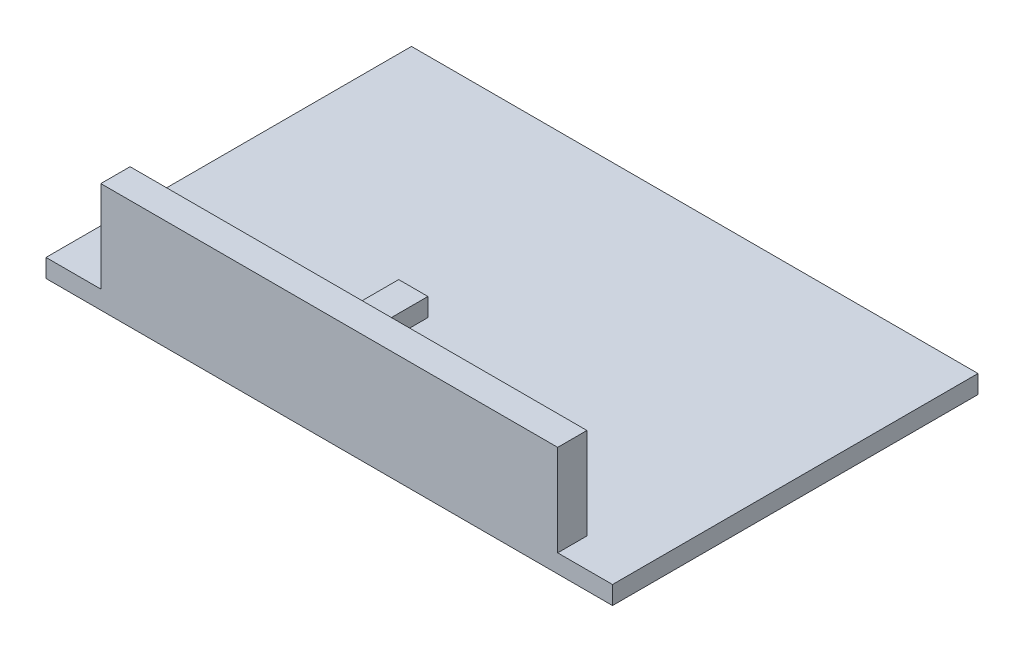
ISO-10303-21;
HEADER;
FILE_DESCRIPTION(('STEP AP214'),'2;1');
FILE_NAME('part.step','',(''),(''),'','','');
FILE_SCHEMA(('AUTOMOTIVE_DESIGN { 1 0 10303 214 1 1 1 1 }'));
ENDSEC;
DATA;
#1=APPLICATION_CONTEXT('core data for automotive mechanical design processes');
#2=APPLICATION_PROTOCOL_DEFINITION('international standard','automotive_design',2000,#1);
#3=PRODUCT_CONTEXT('',#1,'mechanical');
#4=PRODUCT('Part','Part','',(#3));
#5=PRODUCT_RELATED_PRODUCT_CATEGORY('part','',(#4));
#6=PRODUCT_DEFINITION_FORMATION('','',#4);
#7=PRODUCT_DEFINITION_CONTEXT('part definition',#1,'design');
#8=PRODUCT_DEFINITION('design','',#6,#7);
#9=PRODUCT_DEFINITION_SHAPE('','',#8);
#10=(LENGTH_UNIT() NAMED_UNIT(*) SI_UNIT(.MILLI.,.METRE.));
#11=(NAMED_UNIT(*) PLANE_ANGLE_UNIT() SI_UNIT($,.RADIAN.));
#12=(NAMED_UNIT(*) SI_UNIT($,.STERADIAN.) SOLID_ANGLE_UNIT());
#13=UNCERTAINTY_MEASURE_WITH_UNIT(LENGTH_MEASURE(1.E-05),#10,'distance_accuracy_value','');
#14=(GEOMETRIC_REPRESENTATION_CONTEXT(3) GLOBAL_UNCERTAINTY_ASSIGNED_CONTEXT((#13)) GLOBAL_UNIT_ASSIGNED_CONTEXT((#10,
#11,#12)) REPRESENTATION_CONTEXT('',''));
#15=CARTESIAN_POINT('',(0.,0.,0.));
#16=DIRECTION('',(0.,0.,1.));
#17=DIRECTION('',(1.,0.,0.));
#18=AXIS2_PLACEMENT_3D('',#15,#16,#17);
#19=CARTESIAN_POINT('',(14.9999999999999,30.,-8.));
#20=DIRECTION('',(0.,0.,1.));
#21=DIRECTION('',(1.,0.,0.));
#22=AXIS2_PLACEMENT_3D('',#19,#20,#21);
#23=PLANE('',#22);
#24=DIRECTION('',(-1.,0.,0.));
#25=VECTOR('',#24,1.);
#26=CARTESIAN_POINT('',(14.9999999999999,5.,-8.));
#27=LINE('',#26,#25);
#28=CARTESIAN_POINT('',(140.,5.,-8.));
#29=VERTEX_POINT('',#28);
#30=CARTESIAN_POINT('',(14.9999999999999,5.,-8.));
#31=VERTEX_POINT('',#30);
#32=EDGE_CURVE('E162',#29,#31,#27,.T.);
#33=ORIENTED_EDGE('',*,*,#32,.T.);
#34=DIRECTION('',(0.,-1.,0.));
#35=VECTOR('',#34,1.);
#36=CARTESIAN_POINT('',(14.9999999999999,30.,-8.));
#37=LINE('',#36,#35);
#38=CARTESIAN_POINT('',(14.9999999999999,30.,-8.));
#39=VERTEX_POINT('',#38);
#40=EDGE_CURVE('E167',#39,#31,#37,.T.);
#41=ORIENTED_EDGE('',*,*,#40,.F.);
#42=DIRECTION('',(-1.,0.,0.));
#43=VECTOR('',#42,1.);
#44=CARTESIAN_POINT('',(14.9999999999999,30.,-8.));
#45=LINE('',#44,#43);
#46=CARTESIAN_POINT('',(140.,30.,-8.));
#47=VERTEX_POINT('',#46);
#48=EDGE_CURVE('E166',#47,#39,#45,.T.);
#49=ORIENTED_EDGE('',*,*,#48,.F.);
#50=DIRECTION('',(0.,-1.,0.));
#51=VECTOR('',#50,1.);
#52=CARTESIAN_POINT('',(140.,30.,-8.));
#53=LINE('',#52,#51);
#54=EDGE_CURVE('E175',#47,#29,#53,.T.);
#55=ORIENTED_EDGE('',*,*,#54,.T.);
#56=EDGE_LOOP('',(#33,#41,#49,#55));
#57=FACE_BOUND('',#56,.T.);
#58=DIRECTION('',(0.,-1.,0.));
#59=VECTOR('',#58,1.);
#60=CARTESIAN_POINT('',(81.4999999999999,25.,-8.));
#61=LINE('',#60,#59);
#62=CARTESIAN_POINT('',(81.4999999999999,25.,-8.));
#63=VERTEX_POINT('',#62);
#64=CARTESIAN_POINT('',(81.4999999999999,20.,-8.));
#65=VERTEX_POINT('',#64);
#66=EDGE_CURVE('E148',#63,#65,#61,.T.);
#67=ORIENTED_EDGE('',*,*,#66,.F.);
#68=DIRECTION('',(1.,0.,0.));
#69=VECTOR('',#68,1.);
#70=CARTESIAN_POINT('',(81.4999999999999,25.,-8.));
#71=LINE('',#70,#69);
#72=CARTESIAN_POINT('',(73.4999999999999,25.,-8.));
#73=VERTEX_POINT('',#72);
#74=EDGE_CURVE('E145',#73,#63,#71,.T.);
#75=ORIENTED_EDGE('',*,*,#74,.F.);
#76=DIRECTION('',(0.,1.,0.));
#77=VECTOR('',#76,1.);
#78=CARTESIAN_POINT('',(73.4999999999999,25.,-8.));
#79=LINE('',#78,#77);
#80=CARTESIAN_POINT('',(73.4999999999999,20.,-8.));
#81=VERTEX_POINT('',#80);
#82=EDGE_CURVE('E59',#81,#73,#79,.T.);
#83=ORIENTED_EDGE('',*,*,#82,.F.);
#84=DIRECTION('',(-1.,0.,0.));
#85=VECTOR('',#84,1.);
#86=CARTESIAN_POINT('',(81.4999999999999,20.,-8.));
#87=LINE('',#86,#85);
#88=EDGE_CURVE('E54',#65,#81,#87,.T.);
#89=ORIENTED_EDGE('',*,*,#88,.F.);
#90=EDGE_LOOP('',(#67,#75,#83,#89));
#91=FACE_BOUND('',#90,.T.);
#92=ADVANCED_FACE('F39',(#57,#91),#23,.F.);
#93=CARTESIAN_POINT('',(0.,5.,0.));
#94=DIRECTION('',(0.,-1.,0.));
#95=DIRECTION('',(0.,0.,-1.));
#96=AXIS2_PLACEMENT_3D('',#93,#94,#95);
#97=PLANE('',#96);
#98=DIRECTION('',(0.,0.,1.));
#99=VECTOR('',#98,1.);
#100=CARTESIAN_POINT('',(14.9999999999999,5.,0.));
#101=LINE('',#100,#99);
#102=CARTESIAN_POINT('',(14.9999999999999,5.,0.));
#103=VERTEX_POINT('',#102);
#104=EDGE_CURVE('E149',#31,#103,#101,.T.);
#105=ORIENTED_EDGE('',*,*,#104,.F.);
#106=ORIENTED_EDGE('',*,*,#32,.F.);
#107=DIRECTION('',(0.,0.,-1.));
#108=VECTOR('',#107,1.);
#109=CARTESIAN_POINT('',(140.,5.,0.));
#110=LINE('',#109,#108);
#111=CARTESIAN_POINT('',(140.,5.,0.));
#112=VERTEX_POINT('',#111);
#113=EDGE_CURVE('E152',#112,#29,#110,.T.);
#114=ORIENTED_EDGE('',*,*,#113,.F.);
#115=DIRECTION('',(1.,0.,0.));
#116=VECTOR('',#115,1.);
#117=CARTESIAN_POINT('',(0.,5.,0.));
#118=LINE('',#117,#116);
#119=CARTESIAN_POINT('',(155.,5.,0.));
#120=VERTEX_POINT('',#119);
#121=EDGE_CURVE('E188',#112,#120,#118,.T.);
#122=ORIENTED_EDGE('',*,*,#121,.T.);
#123=DIRECTION('',(0.,0.,-1.));
#124=VECTOR('',#123,1.);
#125=CARTESIAN_POINT('',(155.,5.,0.));
#126=LINE('',#125,#124);
#127=CARTESIAN_POINT('',(155.,5.,-100.));
#128=VERTEX_POINT('',#127);
#129=EDGE_CURVE('E192',#120,#128,#126,.T.);
#130=ORIENTED_EDGE('',*,*,#129,.T.);
#131=DIRECTION('',(-1.,0.,0.));
#132=VECTOR('',#131,1.);
#133=CARTESIAN_POINT('',(0.,5.,-100.));
#134=LINE('',#133,#132);
#135=CARTESIAN_POINT('',(0.,5.,-100.));
#136=VERTEX_POINT('',#135);
#137=EDGE_CURVE('E194',#128,#136,#134,.T.);
#138=ORIENTED_EDGE('',*,*,#137,.T.);
#139=DIRECTION('',(0.,0.,1.));
#140=VECTOR('',#139,1.);
#141=CARTESIAN_POINT('',(0.,5.,0.));
#142=LINE('',#141,#140);
#143=CARTESIAN_POINT('',(0.,5.,0.));
#144=VERTEX_POINT('',#143);
#145=EDGE_CURVE('E185',#136,#144,#142,.T.);
#146=ORIENTED_EDGE('',*,*,#145,.T.);
#147=EDGE_CURVE('E190',#144,#103,#118,.T.);
#148=ORIENTED_EDGE('',*,*,#147,.T.);
#149=EDGE_LOOP('',(#105,#106,#114,#122,#130,#138,#146,#148));
#150=FACE_BOUND('',#149,.T.);
#151=ADVANCED_FACE('F229',(#150),#97,.F.);
#152=CARTESIAN_POINT('',(0.,5.,0.));
#153=DIRECTION('',(1.,0.,0.));
#154=DIRECTION('',(0.,0.,-1.));
#155=AXIS2_PLACEMENT_3D('',#152,#153,#154);
#156=PLANE('',#155);
#157=DIRECTION('',(0.,0.,1.));
#158=VECTOR('',#157,1.);
#159=CARTESIAN_POINT('',(0.,0.,0.));
#160=LINE('',#159,#158);
#161=CARTESIAN_POINT('',(0.,0.,-100.));
#162=VERTEX_POINT('',#161);
#163=CARTESIAN_POINT('',(0.,0.,0.));
#164=VERTEX_POINT('',#163);
#165=EDGE_CURVE('E184',#162,#164,#160,.T.);
#166=ORIENTED_EDGE('',*,*,#165,.T.);
#167=DIRECTION('',(0.,-1.,0.));
#168=VECTOR('',#167,1.);
#169=CARTESIAN_POINT('',(0.,5.,0.));
#170=LINE('',#169,#168);
#171=EDGE_CURVE('E11',#144,#164,#170,.T.);
#172=ORIENTED_EDGE('',*,*,#171,.F.);
#173=ORIENTED_EDGE('',*,*,#145,.F.);
#174=DIRECTION('',(0.,-1.,0.));
#175=VECTOR('',#174,1.);
#176=CARTESIAN_POINT('',(0.,5.,-100.));
#177=LINE('',#176,#175);
#178=EDGE_CURVE('E196',#136,#162,#177,.T.);
#179=ORIENTED_EDGE('',*,*,#178,.T.);
#180=EDGE_LOOP('',(#166,#172,#173,#179));
#181=FACE_BOUND('',#180,.T.);
#182=ADVANCED_FACE('F41',(#181),#156,.F.);
#183=CARTESIAN_POINT('',(0.,5.,0.));
#184=DIRECTION('',(0.,0.,-1.));
#185=DIRECTION('',(-1.,0.,0.));
#186=AXIS2_PLACEMENT_3D('',#183,#184,#185);
#187=PLANE('',#186);
#188=DIRECTION('',(1.,0.,0.));
#189=VECTOR('',#188,1.);
#190=CARTESIAN_POINT('',(0.,0.,0.));
#191=LINE('',#190,#189);
#192=CARTESIAN_POINT('',(155.,0.,0.));
#193=VERTEX_POINT('',#192);
#194=EDGE_CURVE('E199',#164,#193,#191,.T.);
#195=ORIENTED_EDGE('',*,*,#194,.T.);
#196=DIRECTION('',(0.,-1.,0.));
#197=VECTOR('',#196,1.);
#198=CARTESIAN_POINT('',(155.,5.,0.));
#199=LINE('',#198,#197);
#200=EDGE_CURVE('E47',#120,#193,#199,.T.);
#201=ORIENTED_EDGE('',*,*,#200,.F.);
#202=ORIENTED_EDGE('',*,*,#121,.F.);
#203=DIRECTION('',(0.,-1.,0.));
#204=VECTOR('',#203,1.);
#205=CARTESIAN_POINT('',(140.,30.,0.));
#206=LINE('',#205,#204);
#207=CARTESIAN_POINT('',(140.,30.,0.));
#208=VERTEX_POINT('',#207);
#209=EDGE_CURVE('E178',#208,#112,#206,.T.);
#210=ORIENTED_EDGE('',*,*,#209,.F.);
#211=DIRECTION('',(1.,0.,0.));
#212=VECTOR('',#211,1.);
#213=CARTESIAN_POINT('',(14.9999999999999,30.,0.));
#214=LINE('',#213,#212);
#215=CARTESIAN_POINT('',(14.9999999999999,30.,0.));
#216=VERTEX_POINT('',#215);
#217=EDGE_CURVE('E161',#216,#208,#214,.T.);
#218=ORIENTED_EDGE('',*,*,#217,.F.);
#219=DIRECTION('',(0.,-1.,0.));
#220=VECTOR('',#219,1.);
#221=CARTESIAN_POINT('',(14.9999999999999,30.,0.));
#222=LINE('',#221,#220);
#223=EDGE_CURVE('E181',#216,#103,#222,.T.);
#224=ORIENTED_EDGE('',*,*,#223,.T.);
#225=ORIENTED_EDGE('',*,*,#147,.F.);
#226=ORIENTED_EDGE('',*,*,#171,.T.);
#227=EDGE_LOOP('',(#195,#201,#202,#210,#218,#224,#225,#226));
#228=FACE_BOUND('',#227,.T.);
#229=ADVANCED_FACE('F231',(#228),#187,.F.);
#230=CARTESIAN_POINT('',(155.,5.,0.));
#231=DIRECTION('',(-1.,0.,0.));
#232=DIRECTION('',(0.,0.,1.));
#233=AXIS2_PLACEMENT_3D('',#230,#231,#232);
#234=PLANE('',#233);
#235=DIRECTION('',(0.,0.,-1.));
#236=VECTOR('',#235,1.);
#237=CARTESIAN_POINT('',(155.,0.,0.));
#238=LINE('',#237,#236);
#239=CARTESIAN_POINT('',(155.,0.,-100.));
#240=VERTEX_POINT('',#239);
#241=EDGE_CURVE('E201',#193,#240,#238,.T.);
#242=ORIENTED_EDGE('',*,*,#241,.T.);
#243=DIRECTION('',(0.,-1.,0.));
#244=VECTOR('',#243,1.);
#245=CARTESIAN_POINT('',(155.,5.,-100.));
#246=LINE('',#245,#244);
#247=EDGE_CURVE('E206',#128,#240,#246,.T.);
#248=ORIENTED_EDGE('',*,*,#247,.F.);
#249=ORIENTED_EDGE('',*,*,#129,.F.);
#250=ORIENTED_EDGE('',*,*,#200,.T.);
#251=EDGE_LOOP('',(#242,#248,#249,#250));
#252=FACE_BOUND('',#251,.T.);
#253=ADVANCED_FACE('F213',(#252),#234,.F.);
#254=CARTESIAN_POINT('',(0.,5.,-100.));
#255=DIRECTION('',(0.,0.,1.));
#256=DIRECTION('',(1.,0.,0.));
#257=AXIS2_PLACEMENT_3D('',#254,#255,#256);
#258=PLANE('',#257);
#259=DIRECTION('',(-1.,0.,0.));
#260=VECTOR('',#259,1.);
#261=CARTESIAN_POINT('',(0.,0.,-100.));
#262=LINE('',#261,#260);
#263=EDGE_CURVE('E189',#240,#162,#262,.T.);
#264=ORIENTED_EDGE('',*,*,#263,.T.);
#265=ORIENTED_EDGE('',*,*,#178,.F.);
#266=ORIENTED_EDGE('',*,*,#137,.F.);
#267=ORIENTED_EDGE('',*,*,#247,.T.);
#268=EDGE_LOOP('',(#264,#265,#266,#267));
#269=FACE_BOUND('',#268,.T.);
#270=ADVANCED_FACE('F223',(#269),#258,.F.);
#271=CARTESIAN_POINT('',(0.,0.,0.));
#272=DIRECTION('',(0.,-1.,0.));
#273=DIRECTION('',(0.,0.,-1.));
#274=AXIS2_PLACEMENT_3D('',#271,#272,#273);
#275=PLANE('',#274);
#276=ORIENTED_EDGE('',*,*,#165,.F.);
#277=ORIENTED_EDGE('',*,*,#263,.F.);
#278=ORIENTED_EDGE('',*,*,#241,.F.);
#279=ORIENTED_EDGE('',*,*,#194,.F.);
#280=EDGE_LOOP('',(#276,#277,#278,#279));
#281=FACE_BOUND('',#280,.T.);
#282=ADVANCED_FACE('F220',(#281),#275,.T.);
#283=CARTESIAN_POINT('',(14.9999999999999,30.,0.));
#284=DIRECTION('',(1.,0.,0.));
#285=DIRECTION('',(0.,0.,-1.));
#286=AXIS2_PLACEMENT_3D('',#283,#284,#285);
#287=PLANE('',#286);
#288=ORIENTED_EDGE('',*,*,#104,.T.);
#289=ORIENTED_EDGE('',*,*,#223,.F.);
#290=DIRECTION('',(0.,0.,1.));
#291=VECTOR('',#290,1.);
#292=CARTESIAN_POINT('',(14.9999999999999,30.,0.));
#293=LINE('',#292,#291);
#294=EDGE_CURVE('E158',#39,#216,#293,.T.);
#295=ORIENTED_EDGE('',*,*,#294,.F.);
#296=ORIENTED_EDGE('',*,*,#40,.T.);
#297=EDGE_LOOP('',(#288,#289,#295,#296));
#298=FACE_BOUND('',#297,.T.);
#299=ADVANCED_FACE('F243',(#298),#287,.F.);
#300=CARTESIAN_POINT('',(140.,30.,0.));
#301=DIRECTION('',(-1.,0.,0.));
#302=DIRECTION('',(0.,0.,1.));
#303=AXIS2_PLACEMENT_3D('',#300,#301,#302);
#304=PLANE('',#303);
#305=ORIENTED_EDGE('',*,*,#113,.T.);
#306=ORIENTED_EDGE('',*,*,#54,.F.);
#307=DIRECTION('',(0.,0.,-1.));
#308=VECTOR('',#307,1.);
#309=CARTESIAN_POINT('',(140.,30.,0.));
#310=LINE('',#309,#308);
#311=EDGE_CURVE('E164',#208,#47,#310,.T.);
#312=ORIENTED_EDGE('',*,*,#311,.F.);
#313=ORIENTED_EDGE('',*,*,#209,.T.);
#314=EDGE_LOOP('',(#305,#306,#312,#313));
#315=FACE_BOUND('',#314,.T.);
#316=ADVANCED_FACE('F234',(#315),#304,.F.);
#317=CARTESIAN_POINT('',(0.,30.,0.));
#318=DIRECTION('',(0.,-1.,0.));
#319=DIRECTION('',(0.,0.,-1.));
#320=AXIS2_PLACEMENT_3D('',#317,#318,#319);
#321=PLANE('',#320);
#322=ORIENTED_EDGE('',*,*,#294,.T.);
#323=ORIENTED_EDGE('',*,*,#217,.T.);
#324=ORIENTED_EDGE('',*,*,#311,.T.);
#325=ORIENTED_EDGE('',*,*,#48,.T.);
#326=EDGE_LOOP('',(#322,#323,#324,#325));
#327=FACE_BOUND('',#326,.T.);
#328=ADVANCED_FACE('F238',(#327),#321,.F.);
#329=CARTESIAN_POINT('',(81.4999999999999,25.,-23.));
#330=DIRECTION('',(-1.,0.,0.));
#331=DIRECTION('',(0.,0.,1.));
#332=AXIS2_PLACEMENT_3D('',#329,#330,#331);
#333=PLANE('',#332);
#334=ORIENTED_EDGE('',*,*,#66,.T.);
#335=DIRECTION('',(0.,0.,1.));
#336=VECTOR('',#335,1.);
#337=CARTESIAN_POINT('',(81.4999999999999,20.,-23.));
#338=LINE('',#337,#336);
#339=CARTESIAN_POINT('',(81.4999999999999,20.,-23.));
#340=VERTEX_POINT('',#339);
#341=EDGE_CURVE('E129',#340,#65,#338,.T.);
#342=ORIENTED_EDGE('',*,*,#341,.F.);
#343=DIRECTION('',(0.,-1.,0.));
#344=VECTOR('',#343,1.);
#345=CARTESIAN_POINT('',(81.4999999999999,25.,-23.));
#346=LINE('',#345,#344);
#347=CARTESIAN_POINT('',(81.4999999999999,25.,-23.));
#348=VERTEX_POINT('',#347);
#349=EDGE_CURVE('E136',#348,#340,#346,.T.);
#350=ORIENTED_EDGE('',*,*,#349,.F.);
#351=DIRECTION('',(0.,0.,1.));
#352=VECTOR('',#351,1.);
#353=CARTESIAN_POINT('',(81.4999999999999,25.,-23.));
#354=LINE('',#353,#352);
#355=EDGE_CURVE('E252',#348,#63,#354,.T.);
#356=ORIENTED_EDGE('',*,*,#355,.T.);
#357=EDGE_LOOP('',(#334,#342,#350,#356));
#358=FACE_BOUND('',#357,.T.);
#359=ADVANCED_FACE('F147',(#358),#333,.F.);
#360=CARTESIAN_POINT('',(81.4999999999999,20.,-23.));
#361=DIRECTION('',(0.,1.,0.));
#362=DIRECTION('',(0.,0.,1.));
#363=AXIS2_PLACEMENT_3D('',#360,#361,#362);
#364=PLANE('',#363);
#365=ORIENTED_EDGE('',*,*,#88,.T.);
#366=DIRECTION('',(0.,0.,1.));
#367=VECTOR('',#366,1.);
#368=CARTESIAN_POINT('',(73.4999999999999,20.,-23.));
#369=LINE('',#368,#367);
#370=CARTESIAN_POINT('',(73.4999999999999,20.,-23.));
#371=VERTEX_POINT('',#370);
#372=EDGE_CURVE('E132',#371,#81,#369,.T.);
#373=ORIENTED_EDGE('',*,*,#372,.F.);
#374=DIRECTION('',(-1.,0.,0.));
#375=VECTOR('',#374,1.);
#376=CARTESIAN_POINT('',(81.4999999999999,20.,-23.));
#377=LINE('',#376,#375);
#378=EDGE_CURVE('E125',#340,#371,#377,.T.);
#379=ORIENTED_EDGE('',*,*,#378,.F.);
#380=ORIENTED_EDGE('',*,*,#341,.T.);
#381=EDGE_LOOP('',(#365,#373,#379,#380));
#382=FACE_BOUND('',#381,.T.);
#383=ADVANCED_FACE('F127',(#382),#364,.F.);
#384=CARTESIAN_POINT('',(73.4999999999999,25.,-23.));
#385=DIRECTION('',(1.,0.,0.));
#386=DIRECTION('',(0.,0.,-1.));
#387=AXIS2_PLACEMENT_3D('',#384,#385,#386);
#388=PLANE('',#387);
#389=ORIENTED_EDGE('',*,*,#82,.T.);
#390=DIRECTION('',(0.,0.,1.));
#391=VECTOR('',#390,1.);
#392=CARTESIAN_POINT('',(73.4999999999999,25.,-23.));
#393=LINE('',#392,#391);
#394=CARTESIAN_POINT('',(73.4999999999999,25.,-23.));
#395=VERTEX_POINT('',#394);
#396=EDGE_CURVE('E154',#395,#73,#393,.T.);
#397=ORIENTED_EDGE('',*,*,#396,.F.);
#398=DIRECTION('',(0.,1.,0.));
#399=VECTOR('',#398,1.);
#400=CARTESIAN_POINT('',(73.4999999999999,25.,-23.));
#401=LINE('',#400,#399);
#402=EDGE_CURVE('E135',#371,#395,#401,.T.);
#403=ORIENTED_EDGE('',*,*,#402,.F.);
#404=ORIENTED_EDGE('',*,*,#372,.T.);
#405=EDGE_LOOP('',(#389,#397,#403,#404));
#406=FACE_BOUND('',#405,.T.);
#407=ADVANCED_FACE('F261',(#406),#388,.F.);
#408=CARTESIAN_POINT('',(81.4999999999999,25.,-23.));
#409=DIRECTION('',(0.,-1.,0.));
#410=DIRECTION('',(0.,0.,-1.));
#411=AXIS2_PLACEMENT_3D('',#408,#409,#410);
#412=PLANE('',#411);
#413=ORIENTED_EDGE('',*,*,#74,.T.);
#414=ORIENTED_EDGE('',*,*,#355,.F.);
#415=DIRECTION('',(1.,0.,0.));
#416=VECTOR('',#415,1.);
#417=CARTESIAN_POINT('',(81.4999999999999,25.,-23.));
#418=LINE('',#417,#416);
#419=EDGE_CURVE('E141',#395,#348,#418,.T.);
#420=ORIENTED_EDGE('',*,*,#419,.F.);
#421=ORIENTED_EDGE('',*,*,#396,.T.);
#422=EDGE_LOOP('',(#413,#414,#420,#421));
#423=FACE_BOUND('',#422,.T.);
#424=ADVANCED_FACE('F251',(#423),#412,.F.);
#425=CARTESIAN_POINT('',(0.,0.,-23.));
#426=DIRECTION('',(0.,0.,-1.));
#427=DIRECTION('',(-1.,0.,0.));
#428=AXIS2_PLACEMENT_3D('',#425,#426,#427);
#429=PLANE('',#428);
#430=ORIENTED_EDGE('',*,*,#349,.T.);
#431=ORIENTED_EDGE('',*,*,#378,.T.);
#432=ORIENTED_EDGE('',*,*,#402,.T.);
#433=ORIENTED_EDGE('',*,*,#419,.T.);
#434=EDGE_LOOP('',(#430,#431,#432,#433));
#435=FACE_BOUND('',#434,.T.);
#436=ADVANCED_FACE('F139',(#435),#429,.T.);
#437=CLOSED_SHELL('',(#92,#151,#182,#229,#253,#270,#282,#299,#316,#328,#359,#383,#407,#424,#436));
#438=MANIFOLD_SOLID_BREP('B2',#437);
#439=ADVANCED_BREP_SHAPE_REPRESENTATION('',(#18,#438),#14);
#440=SHAPE_DEFINITION_REPRESENTATION(#9,#439);
ENDSEC;
END-ISO-10303-21;
